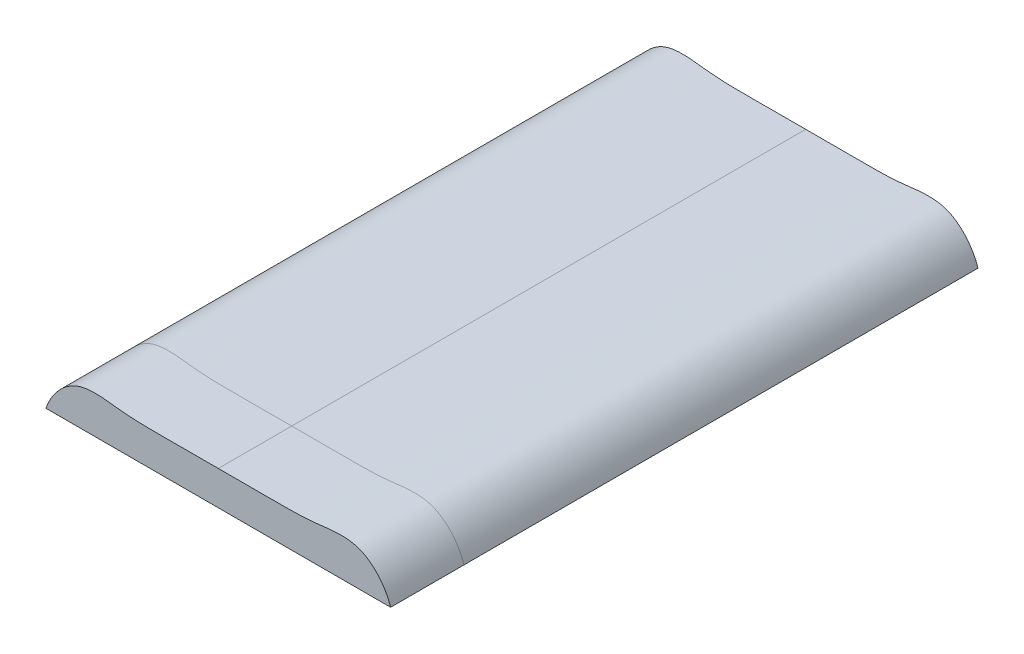
ISO-10303-21;
HEADER;
FILE_DESCRIPTION(('STEP AP214'),'2;1');
FILE_NAME('part.step','',(''),(''),'','','');
FILE_SCHEMA(('AUTOMOTIVE_DESIGN { 1 0 10303 214 1 1 1 1 }'));
ENDSEC;
DATA;
#1=APPLICATION_CONTEXT('core data for automotive mechanical design processes');
#2=APPLICATION_PROTOCOL_DEFINITION('international standard','automotive_design',2000,#1);
#3=PRODUCT_CONTEXT('',#1,'mechanical');
#4=PRODUCT('Part','Part','',(#3));
#5=PRODUCT_RELATED_PRODUCT_CATEGORY('part','',(#4));
#6=PRODUCT_DEFINITION_FORMATION('','',#4);
#7=PRODUCT_DEFINITION_CONTEXT('part definition',#1,'design');
#8=PRODUCT_DEFINITION('design','',#6,#7);
#9=PRODUCT_DEFINITION_SHAPE('','',#8);
#10=(LENGTH_UNIT() NAMED_UNIT(*) SI_UNIT(.MILLI.,.METRE.));
#11=(NAMED_UNIT(*) PLANE_ANGLE_UNIT() SI_UNIT($,.RADIAN.));
#12=(NAMED_UNIT(*) SI_UNIT($,.STERADIAN.) SOLID_ANGLE_UNIT());
#13=UNCERTAINTY_MEASURE_WITH_UNIT(LENGTH_MEASURE(1.E-05),#10,'distance_accuracy_value','');
#14=(GEOMETRIC_REPRESENTATION_CONTEXT(3) GLOBAL_UNCERTAINTY_ASSIGNED_CONTEXT((#13)) GLOBAL_UNIT_ASSIGNED_CONTEXT((#10,
#11,#12)) REPRESENTATION_CONTEXT('',''));
#15=CARTESIAN_POINT('',(0.,0.,0.));
#16=DIRECTION('',(0.,0.,1.));
#17=DIRECTION('',(1.,0.,0.));
#18=AXIS2_PLACEMENT_3D('',#15,#16,#17);
#19=CARTESIAN_POINT('',(20.2,-15.,105.));
#20=DIRECTION('',(0.707106781186546,0.707106781186549,0.));
#21=DIRECTION('',(-0.707106781186549,0.707106781186546,0.));
#22=AXIS2_PLACEMENT_3D('',#19,#20,#21);
#23=PLANE('',#22);
#24=DIRECTION('',(0.707106781186549,-0.707106781186546,0.));
#25=VECTOR('',#24,1.);
#26=CARTESIAN_POINT('',(20.2,-15.,0.));
#27=LINE('',#26,#25);
#28=CARTESIAN_POINT('',(18.7150757595082,-13.5150757595083,0.));
#29=VERTEX_POINT('',#28);
#30=CARTESIAN_POINT('',(20.2,-15.,0.));
#31=VERTEX_POINT('',#30);
#32=EDGE_CURVE('E160',#29,#31,#27,.T.);
#33=ORIENTED_EDGE('',*,*,#32,.T.);
#34=DIRECTION('',(0.,0.,-1.));
#35=VECTOR('',#34,1.);
#36=CARTESIAN_POINT('',(20.2,-15.,105.));
#37=LINE('',#36,#35);
#38=CARTESIAN_POINT('',(20.2,-15.,105.));
#39=VERTEX_POINT('',#38);
#40=EDGE_CURVE('E11',#39,#31,#37,.T.);
#41=ORIENTED_EDGE('',*,*,#40,.F.);
#42=DIRECTION('',(0.707106781186549,-0.707106781186546,0.));
#43=VECTOR('',#42,1.);
#44=CARTESIAN_POINT('',(20.2,-15.,105.));
#45=LINE('',#44,#43);
#46=CARTESIAN_POINT('',(18.7150757595082,-13.5150757595083,105.));
#47=VERTEX_POINT('',#46);
#48=EDGE_CURVE('E190',#47,#39,#45,.T.);
#49=ORIENTED_EDGE('',*,*,#48,.F.);
#50=DIRECTION('',(0.,0.,-1.));
#51=VECTOR('',#50,1.);
#52=CARTESIAN_POINT('',(18.7150757595082,-13.5150757595083,105.));
#53=LINE('',#52,#51);
#54=EDGE_CURVE('E159',#47,#29,#53,.T.);
#55=ORIENTED_EDGE('',*,*,#54,.T.);
#56=EDGE_LOOP('',(#33,#41,#49,#55));
#57=FACE_BOUND('',#56,.T.);
#58=ADVANCED_FACE('F32',(#57),#23,.F.);
#59=CARTESIAN_POINT('',(35.2,-15.,105.));
#60=CARTESIAN_POINT('',(34.2804753444284,-12.0937453643076,105.));
#61=CARTESIAN_POINT('',(29.4244327696648,-5.97022820802393,105.));
#62=CARTESIAN_POINT('',(20.5940926126179,-7.92041743603952,105.));
#63=CARTESIAN_POINT('',(11.0514990120815,-8.10313380560996,105.));
#64=CARTESIAN_POINT('',(4.6374127905957,-7.98759269910698,105.));
#65=CARTESIAN_POINT('',(0.,-8.0301515190165,105.));
#66=B_SPLINE_CURVE_WITH_KNOTS('',3,(#59,#60,#61,#62,#63,#64,#65),.UNSPECIFIED.,.F.,.F.,(4,1,1,1,
4),(0.,0.248741101781159,0.507769795698421,0.637380370450967,1.),.UNSPECIFIED.);
#67=DIRECTION('',(0.,0.,-1.));
#68=VECTOR('',#67,1.);
#69=SURFACE_OF_LINEAR_EXTRUSION('',#66,#68);
#70=CARTESIAN_POINT('',(35.2,-15.,0.));
#71=CARTESIAN_POINT('',(34.2804753444284,-12.0937453643076,0.));
#72=CARTESIAN_POINT('',(29.4244327696648,-5.97022820802393,0.));
#73=CARTESIAN_POINT('',(20.5940926126179,-7.92041743603952,0.));
#74=CARTESIAN_POINT('',(11.0514990120815,-8.10313380560996,0.));
#75=CARTESIAN_POINT('',(4.6374127905957,-7.98759269910698,0.));
#76=CARTESIAN_POINT('',(0.,-8.0301515190165,0.));
#77=B_SPLINE_CURVE_WITH_KNOTS('',3,(#70,#71,#72,#73,#74,#75,#76),.UNSPECIFIED.,.F.,.F.,(4,1,1,1,
4),(0.,0.248741101781159,0.507769795698421,0.637380370450967,1.),.UNSPECIFIED.);
#78=CARTESIAN_POINT('',(35.2,-15.,0.));
#79=VERTEX_POINT('',#78);
#80=CARTESIAN_POINT('',(0.,-8.0301515190165,0.));
#81=VERTEX_POINT('',#80);
#82=EDGE_CURVE('E165',#79,#81,#77,.T.);
#83=ORIENTED_EDGE('',*,*,#82,.T.);
#84=DIRECTION('',(0.,0.,-1.));
#85=VECTOR('',#84,1.);
#86=CARTESIAN_POINT('',(0.,-8.0301515190165,105.));
#87=LINE('',#86,#85);
#88=CARTESIAN_POINT('',(0.,-8.03033431493398,105.));
#89=VERTEX_POINT('',#88);
#90=EDGE_CURVE('E328',#89,#81,#87,.T.);
#91=ORIENTED_EDGE('',*,*,#90,.F.);
#92=CARTESIAN_POINT('',(35.2,-15.,105.));
#93=CARTESIAN_POINT('',(34.2804753444107,-12.0937446836592,105.));
#94=CARTESIAN_POINT('',(29.424432769723,-5.97023045029953,105.));
#95=CARTESIAN_POINT('',(20.594092612475,-7.92041192813757,105.));
#96=CARTESIAN_POINT('',(11.0514990093603,-8.10314997837662,105.));
#97=CARTESIAN_POINT('',(4.6374127814033,-7.98748680429368,105.));
#98=CARTESIAN_POINT('',(0.,-8.03051711085145,105.));
#99=B_SPLINE_CURVE_WITH_KNOTS('',3,(#92,#93,#94,#95,#96,#97,#98),.UNSPECIFIED.,.F.,.F.,(4,1,1,1,
4),(0.,0.24874110171965,0.50776979557286,0.637380370293356,1.),.UNSPECIFIED.);
#100=CARTESIAN_POINT('',(35.2,-15.,105.));
#101=VERTEX_POINT('',#100);
#102=EDGE_CURVE('E207',#101,#89,#99,.T.);
#103=ORIENTED_EDGE('',*,*,#102,.F.);
#104=DIRECTION('',(0.,0.,-1.));
#105=VECTOR('',#104,1.);
#106=CARTESIAN_POINT('',(35.2,-15.,105.));
#107=LINE('',#106,#105);
#108=EDGE_CURVE('E41',#101,#79,#107,.T.);
#109=ORIENTED_EDGE('',*,*,#108,.T.);
#110=EDGE_LOOP('',(#83,#91,#103,#109));
#111=FACE_BOUND('',#110,.T.);
#112=ADVANCED_FACE('F213',(#111),#69,.F.);
#113=CARTESIAN_POINT('',(0.,-8.0301515190165,105.));
#114=CARTESIAN_POINT('',(-4.6374127905957,-7.98759269910698,105.));
#115=CARTESIAN_POINT('',(-11.0514990120815,-8.10313380560995,105.));
#116=CARTESIAN_POINT('',(-20.5940926126179,-7.92041743603952,105.));
#117=CARTESIAN_POINT('',(-29.4244327696648,-5.97022820802393,105.));
#118=CARTESIAN_POINT('',(-34.2804753444284,-12.0937453643076,105.));
#119=CARTESIAN_POINT('',(-35.2,-15.,105.));
#120=B_SPLINE_CURVE_WITH_KNOTS('',3,(#113,#114,#115,#116,#117,#118,#119),.UNSPECIFIED.,.F.,.F.,
(4,1,1,1,4),(0.,0.362619629549033,0.492230204301579,0.751258898218841,1.),.UNSPECIFIED.);
#121=DIRECTION('',(0.,0.,-1.));
#122=VECTOR('',#121,1.);
#123=SURFACE_OF_LINEAR_EXTRUSION('',#120,#122);
#124=CARTESIAN_POINT('',(0.,-8.0301515190165,0.));
#125=CARTESIAN_POINT('',(-4.6374127905957,-7.98759269910698,0.));
#126=CARTESIAN_POINT('',(-11.0514990120815,-8.10313380560995,0.));
#127=CARTESIAN_POINT('',(-20.5940926126179,-7.92041743603952,0.));
#128=CARTESIAN_POINT('',(-29.4244327696648,-5.97022820802393,0.));
#129=CARTESIAN_POINT('',(-34.2804753444284,-12.0937453643076,0.));
#130=CARTESIAN_POINT('',(-35.2,-15.,0.));
#131=B_SPLINE_CURVE_WITH_KNOTS('',3,(#124,#125,#126,#127,#128,#129,#130),.UNSPECIFIED.,.F.,.F.,
(4,1,1,1,4),(0.,0.362619629549033,0.492230204301579,0.751258898218841,1.),.UNSPECIFIED.);
#132=CARTESIAN_POINT('',(-35.2,-15.,0.));
#133=VERTEX_POINT('',#132);
#134=EDGE_CURVE('E169',#81,#133,#131,.T.);
#135=ORIENTED_EDGE('',*,*,#134,.T.);
#136=DIRECTION('',(0.,0.,-1.));
#137=VECTOR('',#136,1.);
#138=CARTESIAN_POINT('',(-35.2,-15.,105.));
#139=LINE('',#138,#137);
#140=CARTESIAN_POINT('',(-35.2,-15.,105.));
#141=VERTEX_POINT('',#140);
#142=EDGE_CURVE('E200',#141,#133,#139,.T.);
#143=ORIENTED_EDGE('',*,*,#142,.F.);
#144=CARTESIAN_POINT('',(0.,-8.03051711085145,105.));
#145=CARTESIAN_POINT('',(-4.6374127814033,-7.98748680429368,105.));
#146=CARTESIAN_POINT('',(-11.0514990093602,-8.10314997837662,105.));
#147=CARTESIAN_POINT('',(-20.594092612475,-7.92041192813757,105.));
#148=CARTESIAN_POINT('',(-29.424432769723,-5.97023045029952,105.));
#149=CARTESIAN_POINT('',(-34.2804753444107,-12.0937446836593,105.));
#150=CARTESIAN_POINT('',(-35.2,-15.,105.));
#151=B_SPLINE_CURVE_WITH_KNOTS('',3,(#144,#145,#146,#147,#148,#149,#150),.UNSPECIFIED.,.F.,.F.,
(4,1,1,1,4),(0.,0.362619629706644,0.49223020442714,0.75125889828035,1.),.UNSPECIFIED.);
#152=EDGE_CURVE('E241',#89,#141,#151,.T.);
#153=ORIENTED_EDGE('',*,*,#152,.F.);
#154=ORIENTED_EDGE('',*,*,#90,.T.);
#155=EDGE_LOOP('',(#135,#143,#153,#154));
#156=FACE_BOUND('',#155,.T.);
#157=ADVANCED_FACE('F223',(#156),#123,.F.);
#158=CARTESIAN_POINT('',(-35.2,-15.,105.));
#159=DIRECTION('',(0.,1.,0.));
#160=DIRECTION('',(-1.,0.,0.));
#161=AXIS2_PLACEMENT_3D('',#158,#159,#160);
#162=PLANE('',#161);
#163=DIRECTION('',(1.,0.,0.));
#164=VECTOR('',#163,1.);
#165=CARTESIAN_POINT('',(-35.2,-15.,0.));
#166=LINE('',#165,#164);
#167=CARTESIAN_POINT('',(-20.2,-15.,0.));
#168=VERTEX_POINT('',#167);
#169=EDGE_CURVE('E176',#133,#168,#166,.T.);
#170=ORIENTED_EDGE('',*,*,#169,.T.);
#171=DIRECTION('',(0.,0.,-1.));
#172=VECTOR('',#171,1.);
#173=CARTESIAN_POINT('',(-20.2,-15.,105.));
#174=LINE('',#173,#172);
#175=CARTESIAN_POINT('',(-20.2,-15.,105.));
#176=VERTEX_POINT('',#175);
#177=EDGE_CURVE('E198',#176,#168,#174,.T.);
#178=ORIENTED_EDGE('',*,*,#177,.F.);
#179=DIRECTION('',(1.,0.,0.));
#180=VECTOR('',#179,1.);
#181=CARTESIAN_POINT('',(-35.2,-15.,105.));
#182=LINE('',#181,#180);
#183=EDGE_CURVE('E254',#176,#39,#182,.T.);
#184=ORIENTED_EDGE('',*,*,#183,.T.);
#185=ORIENTED_EDGE('',*,*,#40,.T.);
#186=DIRECTION('',(1.,0.,0.));
#187=VECTOR('',#186,1.);
#188=CARTESIAN_POINT('',(35.2,-15.,0.));
#189=LINE('',#188,#187);
#190=EDGE_CURVE('E162',#31,#79,#189,.T.);
#191=ORIENTED_EDGE('',*,*,#190,.T.);
#192=ORIENTED_EDGE('',*,*,#108,.F.);
#193=DIRECTION('',(0.,0.,-1.));
#194=VECTOR('',#193,1.);
#195=CARTESIAN_POINT('',(35.2,-15.,120.));
#196=LINE('',#195,#194);
#197=CARTESIAN_POINT('',(35.2,-15.,120.));
#198=VERTEX_POINT('',#197);
#199=EDGE_CURVE('E271',#198,#101,#196,.T.);
#200=ORIENTED_EDGE('',*,*,#199,.F.);
#201=DIRECTION('',(1.,0.,0.));
#202=VECTOR('',#201,1.);
#203=CARTESIAN_POINT('',(-35.2,-15.,120.));
#204=LINE('',#203,#202);
#205=CARTESIAN_POINT('',(-35.2,-15.,120.));
#206=VERTEX_POINT('',#205);
#207=EDGE_CURVE('E259',#206,#198,#204,.T.);
#208=ORIENTED_EDGE('',*,*,#207,.F.);
#209=DIRECTION('',(0.,0.,-1.));
#210=VECTOR('',#209,1.);
#211=CARTESIAN_POINT('',(-35.2,-15.,120.));
#212=LINE('',#211,#210);
#213=EDGE_CURVE('E163',#206,#141,#212,.T.);
#214=ORIENTED_EDGE('',*,*,#213,.T.);
#215=ORIENTED_EDGE('',*,*,#142,.T.);
#216=EDGE_LOOP('',(#170,#178,#184,#185,#191,#192,#200,#208,#214,#215));
#217=FACE_BOUND('',#216,.T.);
#218=ADVANCED_FACE('F256',(#217),#162,.F.);
#219=CARTESIAN_POINT('',(-20.2,-15.,105.));
#220=DIRECTION('',(-0.707106781186546,0.707106781186549,0.));
#221=DIRECTION('',(-0.707106781186549,-0.707106781186546,0.));
#222=AXIS2_PLACEMENT_3D('',#219,#220,#221);
#223=PLANE('',#222);
#224=DIRECTION('',(0.707106781186549,0.707106781186546,0.));
#225=VECTOR('',#224,1.);
#226=CARTESIAN_POINT('',(-20.2,-15.,0.));
#227=LINE('',#226,#225);
#228=CARTESIAN_POINT('',(-18.7150757595082,-13.5150757595083,0.));
#229=VERTEX_POINT('',#228);
#230=EDGE_CURVE('E181',#168,#229,#227,.T.);
#231=ORIENTED_EDGE('',*,*,#230,.T.);
#232=DIRECTION('',(0.,0.,-1.));
#233=VECTOR('',#232,1.);
#234=CARTESIAN_POINT('',(-18.7150757595082,-13.5150757595083,105.));
#235=LINE('',#234,#233);
#236=CARTESIAN_POINT('',(-18.7150757595082,-13.5150757595083,105.));
#237=VERTEX_POINT('',#236);
#238=EDGE_CURVE('E195',#237,#229,#235,.T.);
#239=ORIENTED_EDGE('',*,*,#238,.F.);
#240=DIRECTION('',(0.707106781186549,0.707106781186546,0.));
#241=VECTOR('',#240,1.);
#242=CARTESIAN_POINT('',(-20.2,-15.,105.));
#243=LINE('',#242,#241);
#244=EDGE_CURVE('E152',#176,#237,#243,.T.);
#245=ORIENTED_EDGE('',*,*,#244,.F.);
#246=ORIENTED_EDGE('',*,*,#177,.T.);
#247=EDGE_LOOP('',(#231,#239,#245,#246));
#248=FACE_BOUND('',#247,.T.);
#249=ADVANCED_FACE('F350',(#248),#223,.F.);
#250=CARTESIAN_POINT('',(-18.7150757595082,-13.5150757595083,105.));
#251=DIRECTION('',(-0.707106781186547,-0.707106781186548,0.));
#252=DIRECTION('',(0.707106781186548,-0.707106781186547,0.));
#253=AXIS2_PLACEMENT_3D('',#250,#251,#252);
#254=PLANE('',#253);
#255=DIRECTION('',(-0.707106781186548,0.707106781186547,0.));
#256=VECTOR('',#255,1.);
#257=CARTESIAN_POINT('',(-18.7150757595082,-13.5150757595083,0.));
#258=LINE('',#257,#256);
#259=CARTESIAN_POINT('',(-20.2,-12.0301515190165,0.));
#260=VERTEX_POINT('',#259);
#261=EDGE_CURVE('E183',#229,#260,#258,.T.);
#262=ORIENTED_EDGE('',*,*,#261,.T.);
#263=DIRECTION('',(0.,0.,-1.));
#264=VECTOR('',#263,1.);
#265=CARTESIAN_POINT('',(-20.2,-12.0301515190165,105.));
#266=LINE('',#265,#264);
#267=CARTESIAN_POINT('',(-20.2,-12.0301515190165,105.));
#268=VERTEX_POINT('',#267);
#269=EDGE_CURVE('E136',#268,#260,#266,.T.);
#270=ORIENTED_EDGE('',*,*,#269,.F.);
#271=DIRECTION('',(-0.707106781186548,0.707106781186547,0.));
#272=VECTOR('',#271,1.);
#273=CARTESIAN_POINT('',(-18.7150757595082,-13.5150757595083,105.));
#274=LINE('',#273,#272);
#275=EDGE_CURVE('E150',#237,#268,#274,.T.);
#276=ORIENTED_EDGE('',*,*,#275,.F.);
#277=ORIENTED_EDGE('',*,*,#238,.T.);
#278=EDGE_LOOP('',(#262,#270,#276,#277));
#279=FACE_BOUND('',#278,.T.);
#280=ADVANCED_FACE('F352',(#279),#254,.F.);
#281=CARTESIAN_POINT('',(-20.2,-12.0301515190165,105.));
#282=DIRECTION('',(-1.,0.,0.));
#283=DIRECTION('',(0.,0.,1.));
#284=AXIS2_PLACEMENT_3D('',#281,#282,#283);
#285=PLANE('',#284);
#286=DIRECTION('',(0.,1.,0.));
#287=VECTOR('',#286,1.);
#288=CARTESIAN_POINT('',(-20.2,-12.0301515190165,0.));
#289=LINE('',#288,#287);
#290=CARTESIAN_POINT('',(-20.2,-10.0301515190165,0.));
#291=VERTEX_POINT('',#290);
#292=EDGE_CURVE('E133',#260,#291,#289,.T.);
#293=ORIENTED_EDGE('',*,*,#292,.T.);
#294=DIRECTION('',(0.,0.,-1.));
#295=VECTOR('',#294,1.);
#296=CARTESIAN_POINT('',(-20.2,-10.0301515190165,105.));
#297=LINE('',#296,#295);
#298=CARTESIAN_POINT('',(-20.2,-10.0301515190165,105.));
#299=VERTEX_POINT('',#298);
#300=EDGE_CURVE('E125',#299,#291,#297,.T.);
#301=ORIENTED_EDGE('',*,*,#300,.F.);
#302=DIRECTION('',(0.,1.,0.));
#303=VECTOR('',#302,1.);
#304=CARTESIAN_POINT('',(-20.2,-12.0301515190165,105.));
#305=LINE('',#304,#303);
#306=EDGE_CURVE('E130',#268,#299,#305,.T.);
#307=ORIENTED_EDGE('',*,*,#306,.F.);
#308=ORIENTED_EDGE('',*,*,#269,.T.);
#309=EDGE_LOOP('',(#293,#301,#307,#308));
#310=FACE_BOUND('',#309,.T.);
#311=ADVANCED_FACE('F127',(#310),#285,.F.);
#312=CARTESIAN_POINT('',(-20.2,-10.0301515190165,105.));
#313=DIRECTION('',(0.,1.,0.));
#314=DIRECTION('',(0.,0.,1.));
#315=AXIS2_PLACEMENT_3D('',#312,#313,#314);
#316=PLANE('',#315);
#317=DIRECTION('',(1.,0.,0.));
#318=VECTOR('',#317,1.);
#319=CARTESIAN_POINT('',(-20.2,-10.0301515190165,0.));
#320=LINE('',#319,#318);
#321=CARTESIAN_POINT('',(20.2,-10.0301515190165,0.));
#322=VERTEX_POINT('',#321);
#323=EDGE_CURVE('E186',#291,#322,#320,.T.);
#324=ORIENTED_EDGE('',*,*,#323,.T.);
#325=DIRECTION('',(0.,0.,-1.));
#326=VECTOR('',#325,1.);
#327=CARTESIAN_POINT('',(20.2,-10.0301515190165,105.));
#328=LINE('',#327,#326);
#329=CARTESIAN_POINT('',(20.2,-10.0301515190165,105.));
#330=VERTEX_POINT('',#329);
#331=EDGE_CURVE('E137',#330,#322,#328,.T.);
#332=ORIENTED_EDGE('',*,*,#331,.F.);
#333=DIRECTION('',(1.,0.,0.));
#334=VECTOR('',#333,1.);
#335=CARTESIAN_POINT('',(-20.2,-10.0301515190165,105.));
#336=LINE('',#335,#334);
#337=EDGE_CURVE('E140',#299,#330,#336,.T.);
#338=ORIENTED_EDGE('',*,*,#337,.F.);
#339=ORIENTED_EDGE('',*,*,#300,.T.);
#340=EDGE_LOOP('',(#324,#332,#338,#339));
#341=FACE_BOUND('',#340,.T.);
#342=ADVANCED_FACE('F141',(#341),#316,.F.);
#343=CARTESIAN_POINT('',(20.2,-12.0301515190165,105.));
#344=DIRECTION('',(1.,0.,0.));
#345=DIRECTION('',(0.,0.,-1.));
#346=AXIS2_PLACEMENT_3D('',#343,#344,#345);
#347=PLANE('',#346);
#348=DIRECTION('',(0.,-1.,0.));
#349=VECTOR('',#348,1.);
#350=CARTESIAN_POINT('',(20.2,-12.0301515190165,0.));
#351=LINE('',#350,#349);
#352=CARTESIAN_POINT('',(20.2,-12.0301515190165,0.));
#353=VERTEX_POINT('',#352);
#354=EDGE_CURVE('E87',#322,#353,#351,.T.);
#355=ORIENTED_EDGE('',*,*,#354,.T.);
#356=DIRECTION('',(0.,0.,-1.));
#357=VECTOR('',#356,1.);
#358=CARTESIAN_POINT('',(20.2,-12.0301515190165,105.));
#359=LINE('',#358,#357);
#360=CARTESIAN_POINT('',(20.2,-12.0301515190165,105.));
#361=VERTEX_POINT('',#360);
#362=EDGE_CURVE('E50',#361,#353,#359,.T.);
#363=ORIENTED_EDGE('',*,*,#362,.F.);
#364=DIRECTION('',(0.,-1.,0.));
#365=VECTOR('',#364,1.);
#366=CARTESIAN_POINT('',(20.2,-12.0301515190165,105.));
#367=LINE('',#366,#365);
#368=EDGE_CURVE('E144',#330,#361,#367,.T.);
#369=ORIENTED_EDGE('',*,*,#368,.F.);
#370=ORIENTED_EDGE('',*,*,#331,.T.);
#371=EDGE_LOOP('',(#355,#363,#369,#370));
#372=FACE_BOUND('',#371,.T.);
#373=ADVANCED_FACE('F353',(#372),#347,.F.);
#374=CARTESIAN_POINT('',(18.7150757595082,-13.5150757595083,105.));
#375=DIRECTION('',(0.707106781186547,-0.707106781186548,0.));
#376=DIRECTION('',(0.707106781186548,0.707106781186547,0.));
#377=AXIS2_PLACEMENT_3D('',#374,#375,#376);
#378=PLANE('',#377);
#379=DIRECTION('',(-0.707106781186548,-0.707106781186547,0.));
#380=VECTOR('',#379,1.);
#381=CARTESIAN_POINT('',(18.7150757595082,-13.5150757595083,0.));
#382=LINE('',#381,#380);
#383=EDGE_CURVE('E93',#353,#29,#382,.T.);
#384=ORIENTED_EDGE('',*,*,#383,.T.);
#385=ORIENTED_EDGE('',*,*,#54,.F.);
#386=DIRECTION('',(-0.707106781186548,-0.707106781186547,0.));
#387=VECTOR('',#386,1.);
#388=CARTESIAN_POINT('',(18.7150757595082,-13.5150757595083,105.));
#389=LINE('',#388,#387);
#390=EDGE_CURVE('E157',#361,#47,#389,.T.);
#391=ORIENTED_EDGE('',*,*,#390,.F.);
#392=ORIENTED_EDGE('',*,*,#362,.T.);
#393=EDGE_LOOP('',(#384,#385,#391,#392));
#394=FACE_BOUND('',#393,.T.);
#395=ADVANCED_FACE('F355',(#394),#378,.F.);
#396=CARTESIAN_POINT('',(-19.3055502494781,-7.80134258013436,0.));
#397=DIRECTION('',(0.,0.,1.));
#398=DIRECTION('',(1.,0.,0.));
#399=AXIS2_PLACEMENT_3D('',#396,#397,#398);
#400=PLANE('',#399);
#401=ORIENTED_EDGE('',*,*,#32,.F.);
#402=ORIENTED_EDGE('',*,*,#383,.F.);
#403=ORIENTED_EDGE('',*,*,#354,.F.);
#404=ORIENTED_EDGE('',*,*,#323,.F.);
#405=ORIENTED_EDGE('',*,*,#292,.F.);
#406=ORIENTED_EDGE('',*,*,#261,.F.);
#407=ORIENTED_EDGE('',*,*,#230,.F.);
#408=ORIENTED_EDGE('',*,*,#169,.F.);
#409=ORIENTED_EDGE('',*,*,#134,.F.);
#410=ORIENTED_EDGE('',*,*,#82,.F.);
#411=ORIENTED_EDGE('',*,*,#190,.F.);
#412=EDGE_LOOP('',(#401,#402,#403,#404,#405,#406,#407,#408,#409,#410,#411));
#413=FACE_BOUND('',#412,.T.);
#414=ADVANCED_FACE('F296',(#413),#400,.F.);
#415=CARTESIAN_POINT('',(-19.3055502445993,-7.8013422456479,105.));
#416=DIRECTION('',(0.,0.,1.));
#417=DIRECTION('',(1.,0.,0.));
#418=AXIS2_PLACEMENT_3D('',#415,#416,#417);
#419=PLANE('',#418);
#420=ORIENTED_EDGE('',*,*,#390,.T.);
#421=ORIENTED_EDGE('',*,*,#48,.T.);
#422=ORIENTED_EDGE('',*,*,#183,.F.);
#423=ORIENTED_EDGE('',*,*,#244,.T.);
#424=ORIENTED_EDGE('',*,*,#275,.T.);
#425=ORIENTED_EDGE('',*,*,#306,.T.);
#426=ORIENTED_EDGE('',*,*,#337,.T.);
#427=ORIENTED_EDGE('',*,*,#368,.T.);
#428=EDGE_LOOP('',(#420,#421,#422,#423,#424,#425,#426,#427));
#429=FACE_BOUND('',#428,.T.);
#430=ADVANCED_FACE('F147',(#429),#419,.F.);
#431=CARTESIAN_POINT('',(0.,-8.03051711085145,120.));
#432=CARTESIAN_POINT('',(-4.6374127814033,-7.98748680429368,120.));
#433=CARTESIAN_POINT('',(-11.0514990093602,-8.10314997837662,120.));
#434=CARTESIAN_POINT('',(-20.594092612475,-7.92041192813757,120.));
#435=CARTESIAN_POINT('',(-29.424432769723,-5.97023045029952,120.));
#436=CARTESIAN_POINT('',(-34.2804753444107,-12.0937446836593,120.));
#437=CARTESIAN_POINT('',(-35.2,-15.,120.));
#438=B_SPLINE_CURVE_WITH_KNOTS('',3,(#431,#432,#433,#434,#435,#436,#437),.UNSPECIFIED.,.F.,.F.,
(4,1,1,1,4),(0.,0.362619629706644,0.49223020442714,0.75125889828035,1.),.UNSPECIFIED.);
#439=DIRECTION('',(0.,0.,-1.));
#440=VECTOR('',#439,1.);
#441=SURFACE_OF_LINEAR_EXTRUSION('',#438,#440);
#442=ORIENTED_EDGE('',*,*,#152,.T.);
#443=ORIENTED_EDGE('',*,*,#213,.F.);
#444=CARTESIAN_POINT('',(0.,-8.03051711085145,120.));
#445=VERTEX_POINT('',#444);
#446=EDGE_CURVE('E257',#445,#206,#438,.T.);
#447=ORIENTED_EDGE('',*,*,#446,.F.);
#448=DIRECTION('',(0.,0.,-1.));
#449=VECTOR('',#448,1.);
#450=CARTESIAN_POINT('',(0.,-8.03051711085145,120.));
#451=LINE('',#450,#449);
#452=EDGE_CURVE('E273',#445,#89,#451,.T.);
#453=ORIENTED_EDGE('',*,*,#452,.T.);
#454=EDGE_LOOP('',(#442,#443,#447,#453));
#455=FACE_BOUND('',#454,.T.);
#456=ADVANCED_FACE('F283',(#455),#441,.F.);
#457=CARTESIAN_POINT('',(35.2,-15.,120.));
#458=CARTESIAN_POINT('',(34.2804753444107,-12.0937446836592,120.));
#459=CARTESIAN_POINT('',(29.424432769723,-5.97023045029953,120.));
#460=CARTESIAN_POINT('',(20.594092612475,-7.92041192813757,120.));
#461=CARTESIAN_POINT('',(11.0514990093603,-8.10314997837662,120.));
#462=CARTESIAN_POINT('',(4.6374127814033,-7.98748680429368,120.));
#463=CARTESIAN_POINT('',(0.,-8.03051711085145,120.));
#464=B_SPLINE_CURVE_WITH_KNOTS('',3,(#457,#458,#459,#460,#461,#462,#463),.UNSPECIFIED.,.F.,.F.,
(4,1,1,1,4),(0.,0.24874110171965,0.50776979557286,0.637380370293356,1.),.UNSPECIFIED.);
#465=DIRECTION('',(0.,0.,-1.));
#466=VECTOR('',#465,1.);
#467=SURFACE_OF_LINEAR_EXTRUSION('',#464,#466);
#468=ORIENTED_EDGE('',*,*,#102,.T.);
#469=ORIENTED_EDGE('',*,*,#452,.F.);
#470=EDGE_CURVE('E277',#198,#445,#464,.T.);
#471=ORIENTED_EDGE('',*,*,#470,.F.);
#472=ORIENTED_EDGE('',*,*,#199,.T.);
#473=EDGE_LOOP('',(#468,#469,#471,#472));
#474=FACE_BOUND('',#473,.T.);
#475=ADVANCED_FACE('F292',(#474),#467,.F.);
#476=CARTESIAN_POINT('',(-19.3055502445993,-7.8013422456479,120.));
#477=DIRECTION('',(0.,0.,1.));
#478=DIRECTION('',(1.,0.,0.));
#479=AXIS2_PLACEMENT_3D('',#476,#477,#478);
#480=PLANE('',#479);
#481=ORIENTED_EDGE('',*,*,#446,.T.);
#482=ORIENTED_EDGE('',*,*,#207,.T.);
#483=ORIENTED_EDGE('',*,*,#470,.T.);
#484=EDGE_LOOP('',(#481,#482,#483));
#485=FACE_BOUND('',#484,.T.);
#486=ADVANCED_FACE('F316',(#485),#480,.T.);
#487=CLOSED_SHELL('',(#58,#112,#157,#218,#249,#280,#311,#342,#373,#395,#414,#430,#456,#475,#486));
#488=MANIFOLD_SOLID_BREP('B2',#487);
#489=ADVANCED_BREP_SHAPE_REPRESENTATION('',(#18,#488),#14);
#490=SHAPE_DEFINITION_REPRESENTATION(#9,#489);
ENDSEC;
END-ISO-10303-21;
